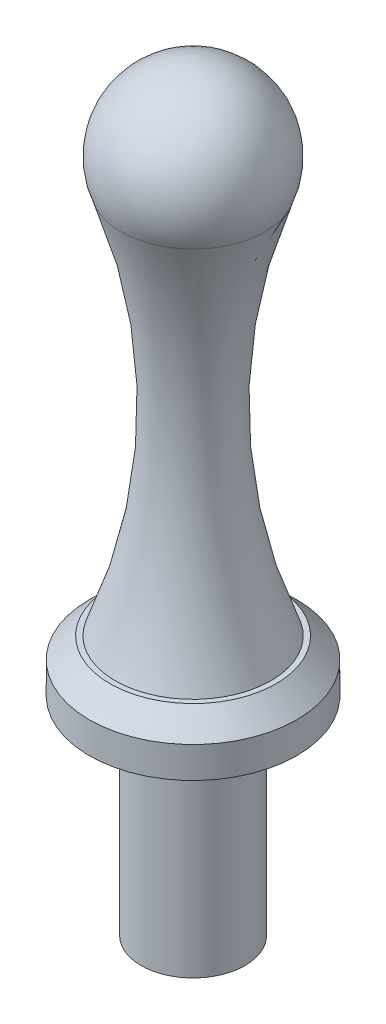
ISO-10303-21;
HEADER;
FILE_DESCRIPTION(('STEP AP214'),'2;1');
FILE_NAME('part.step','',(''),(''),'','','');
FILE_SCHEMA(('AUTOMOTIVE_DESIGN { 1 0 10303 214 1 1 1 1 }'));
ENDSEC;
DATA;
#1=APPLICATION_CONTEXT('core data for automotive mechanical design processes');
#2=APPLICATION_PROTOCOL_DEFINITION('international standard','automotive_design',2000,#1);
#3=PRODUCT_CONTEXT('',#1,'mechanical');
#4=PRODUCT('Part','Part','',(#3));
#5=PRODUCT_RELATED_PRODUCT_CATEGORY('part','',(#4));
#6=PRODUCT_DEFINITION_FORMATION('','',#4);
#7=PRODUCT_DEFINITION_CONTEXT('part definition',#1,'design');
#8=PRODUCT_DEFINITION('design','',#6,#7);
#9=PRODUCT_DEFINITION_SHAPE('','',#8);
#10=(LENGTH_UNIT() NAMED_UNIT(*) SI_UNIT(.MILLI.,.METRE.));
#11=(NAMED_UNIT(*) PLANE_ANGLE_UNIT() SI_UNIT($,.RADIAN.));
#12=(NAMED_UNIT(*) SI_UNIT($,.STERADIAN.) SOLID_ANGLE_UNIT());
#13=UNCERTAINTY_MEASURE_WITH_UNIT(LENGTH_MEASURE(1.E-05),#10,'distance_accuracy_value','');
#14=(GEOMETRIC_REPRESENTATION_CONTEXT(3) GLOBAL_UNCERTAINTY_ASSIGNED_CONTEXT((#13)) GLOBAL_UNIT_ASSIGNED_CONTEXT((#10,
#11,#12)) REPRESENTATION_CONTEXT('',''));
#15=CARTESIAN_POINT('',(0.,0.,0.));
#16=DIRECTION('',(0.,0.,1.));
#17=DIRECTION('',(1.,0.,0.));
#18=AXIS2_PLACEMENT_3D('',#15,#16,#17);
#19=CARTESIAN_POINT('',(0.,34.925,0.));
#20=DIRECTION('',(0.,-1.,0.));
#21=DIRECTION('',(-1.,0.,0.));
#22=AXIS2_PLACEMENT_3D('',#19,#20,#21);
#23=SPHERICAL_SURFACE('',#22,4.7625);
#24=CARTESIAN_POINT('',(0.,33.1024701533612,0.));
#25=DIRECTION('',(0.,-1.,0.));
#26=DIRECTION('',(1.,0.,0.));
#27=AXIS2_PLACEMENT_3D('',#24,#25,#26);
#28=CIRCLE('',#27,4.39997627358498);
#29=CARTESIAN_POINT('',(4.39997627358498,33.1024701533612,0.));
#30=VERTEX_POINT('',#29);
#31=EDGE_CURVE('E44',#30,#30,#28,.T.);
#32=ORIENTED_EDGE('',*,*,#31,.F.);
#33=EDGE_LOOP('',(#32));
#34=FACE_BOUND('',#33,.T.);
#35=ADVANCED_FACE('F33',(#34),#23,.T.);
#36=CARTESIAN_POINT('',(0.,21.7894036130617,0.));
#37=DIRECTION('',(0.,-1.,0.));
#38=DIRECTION('',(1.,0.,0.));
#39=AXIS2_PLACEMENT_3D('',#36,#37,#38);
#40=TOROIDAL_SURFACE('',#39,35.5173118396757,33.1100294061775);
#41=CARTESIAN_POINT('',(0.,9.525,0.));
#42=DIRECTION('',(0.,-1.,0.));
#43=DIRECTION('',(1.,0.,0.));
#44=AXIS2_PLACEMENT_3D('',#41,#42,#43);
#45=CIRCLE('',#44,4.7625);
#46=CARTESIAN_POINT('',(4.7625,9.525,0.));
#47=VERTEX_POINT('',#46);
#48=EDGE_CURVE('E48',#47,#47,#45,.T.);
#49=ORIENTED_EDGE('',*,*,#48,.F.);
#50=EDGE_LOOP('',(#49));
#51=FACE_BOUND('',#50,.T.);
#52=ORIENTED_EDGE('',*,*,#31,.T.);
#53=EDGE_LOOP('',(#52));
#54=FACE_BOUND('',#53,.T.);
#55=ADVANCED_FACE('F79',(#51,#54),#40,.F.);
#56=CARTESIAN_POINT('',(0.,9.525,0.));
#57=DIRECTION('',(0.,1.,0.));
#58=DIRECTION('',(-1.,0.,0.));
#59=AXIS2_PLACEMENT_3D('',#56,#57,#58);
#60=PLANE('',#59);
#61=CARTESIAN_POINT('',(0.,9.525,0.));
#62=DIRECTION('',(0.,1.,0.));
#63=DIRECTION('',(-1.,0.,0.));
#64=AXIS2_PLACEMENT_3D('',#61,#62,#63);
#65=CIRCLE('',#64,5.07999999999999);
#66=CARTESIAN_POINT('',(-5.07999999999999,9.525,0.));
#67=VERTEX_POINT('',#66);
#68=EDGE_CURVE('E10',#67,#67,#65,.T.);
#69=ORIENTED_EDGE('',*,*,#68,.T.);
#70=EDGE_LOOP('',(#69));
#71=FACE_BOUND('',#70,.T.);
#72=ORIENTED_EDGE('',*,*,#48,.T.);
#73=EDGE_LOOP('',(#72));
#74=FACE_BOUND('',#73,.T.);
#75=ADVANCED_FACE('F84',(#71,#74),#60,.T.);
#76=CARTESIAN_POINT('',(0.,45.9243052378594,0.));
#77=DIRECTION('',(0.,-1.,0.));
#78=DIRECTION('',(1.,0.,0.));
#79=AXIS2_PLACEMENT_3D('',#76,#77,#78);
#80=CYLINDRICAL_SURFACE('',#79,6.35);
#81=CARTESIAN_POINT('',(0.,8.25500000000001,0.));
#82=DIRECTION('',(0.,1.,0.));
#83=DIRECTION('',(-1.,0.,0.));
#84=AXIS2_PLACEMENT_3D('',#81,#82,#83);
#85=CIRCLE('',#84,6.35);
#86=CARTESIAN_POINT('',(-6.35,8.25500000000001,0.));
#87=VERTEX_POINT('',#86);
#88=EDGE_CURVE('E40',#87,#87,#85,.F.);
#89=ORIENTED_EDGE('',*,*,#88,.T.);
#90=EDGE_LOOP('',(#89));
#91=FACE_BOUND('',#90,.T.);
#92=CARTESIAN_POINT('',(0.,6.35,0.));
#93=DIRECTION('',(0.,-1.,0.));
#94=DIRECTION('',(1.,0.,0.));
#95=AXIS2_PLACEMENT_3D('',#92,#93,#94);
#96=CIRCLE('',#95,6.35);
#97=CARTESIAN_POINT('',(6.34999999999999,6.35,0.));
#98=VERTEX_POINT('',#97);
#99=EDGE_CURVE('E53',#98,#98,#96,.T.);
#100=ORIENTED_EDGE('',*,*,#99,.F.);
#101=EDGE_LOOP('',(#100));
#102=FACE_BOUND('',#101,.T.);
#103=ADVANCED_FACE('F75',(#91,#102),#80,.T.);
#104=CARTESIAN_POINT('',(0.,6.35,0.));
#105=DIRECTION('',(0.,1.,0.));
#106=DIRECTION('',(-1.,0.,0.));
#107=AXIS2_PLACEMENT_3D('',#104,#105,#106);
#108=PLANE('',#107);
#109=CARTESIAN_POINT('',(0.,6.35,0.));
#110=DIRECTION('',(0.,-1.,0.));
#111=DIRECTION('',(1.,0.,0.));
#112=AXIS2_PLACEMENT_3D('',#109,#110,#111);
#113=CIRCLE('',#112,3.175);
#114=CARTESIAN_POINT('',(3.175,6.35,0.));
#115=VERTEX_POINT('',#114);
#116=EDGE_CURVE('E56',#115,#115,#113,.T.);
#117=ORIENTED_EDGE('',*,*,#116,.F.);
#118=EDGE_LOOP('',(#117));
#119=FACE_BOUND('',#118,.T.);
#120=ORIENTED_EDGE('',*,*,#99,.T.);
#121=EDGE_LOOP('',(#120));
#122=FACE_BOUND('',#121,.T.);
#123=ADVANCED_FACE('F67',(#119,#122),#108,.F.);
#124=CARTESIAN_POINT('',(0.,45.9243052378594,0.));
#125=DIRECTION('',(0.,-1.,0.));
#126=DIRECTION('',(1.,0.,0.));
#127=AXIS2_PLACEMENT_3D('',#124,#125,#126);
#128=CYLINDRICAL_SURFACE('',#127,3.175);
#129=ORIENTED_EDGE('',*,*,#116,.T.);
#130=EDGE_LOOP('',(#129));
#131=FACE_BOUND('',#130,.T.);
#132=CARTESIAN_POINT('',(0.,-6.35,0.));
#133=DIRECTION('',(0.,-1.,0.));
#134=DIRECTION('',(1.,0.,0.));
#135=AXIS2_PLACEMENT_3D('',#132,#133,#134);
#136=CIRCLE('',#135,3.175);
#137=CARTESIAN_POINT('',(3.175,-6.35,0.));
#138=VERTEX_POINT('',#137);
#139=EDGE_CURVE('E59',#138,#138,#136,.T.);
#140=ORIENTED_EDGE('',*,*,#139,.F.);
#141=EDGE_LOOP('',(#140));
#142=FACE_BOUND('',#141,.T.);
#143=ADVANCED_FACE('F65',(#131,#142),#128,.T.);
#144=CARTESIAN_POINT('',(0.,-6.35,0.));
#145=DIRECTION('',(0.,1.,0.));
#146=DIRECTION('',(-1.,0.,0.));
#147=AXIS2_PLACEMENT_3D('',#144,#145,#146);
#148=PLANE('',#147);
#149=ORIENTED_EDGE('',*,*,#139,.T.);
#150=EDGE_LOOP('',(#149));
#151=FACE_BOUND('',#150,.T.);
#152=ADVANCED_FACE('F63',(#151),#148,.F.);
#153=CARTESIAN_POINT('',(0.,8.25500000000001,0.));
#154=DIRECTION('',(0.,-1.,0.));
#155=DIRECTION('',(1.,0.,0.));
#156=AXIS2_PLACEMENT_3D('',#153,#154,#155);
#157=CONICAL_SURFACE('',#156,6.35,0.785398163397451);
#158=ORIENTED_EDGE('',*,*,#68,.F.);
#159=EDGE_LOOP('',(#158));
#160=FACE_BOUND('',#159,.T.);
#161=ORIENTED_EDGE('',*,*,#88,.F.);
#162=EDGE_LOOP('',(#161));
#163=FACE_BOUND('',#162,.T.);
#164=ADVANCED_FACE('F35',(#160,#163),#157,.T.);
#165=CLOSED_SHELL('',(#35,#55,#75,#103,#123,#143,#152,#164));
#166=MANIFOLD_SOLID_BREP('B2',#165);
#167=ADVANCED_BREP_SHAPE_REPRESENTATION('',(#18,#166),#14);
#168=SHAPE_DEFINITION_REPRESENTATION(#9,#167);
ENDSEC;
END-ISO-10303-21;
